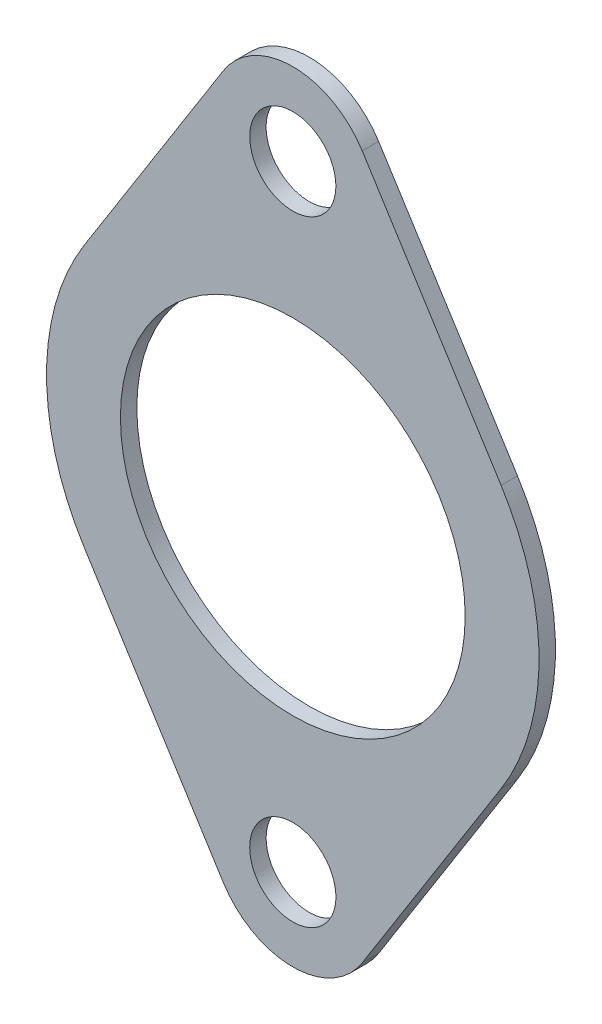
ISO-10303-21;
HEADER;
FILE_DESCRIPTION(('STEP AP214'),'2;1');
FILE_NAME('part.step','',(''),(''),'','','');
FILE_SCHEMA(('AUTOMOTIVE_DESIGN { 1 0 10303 214 1 1 1 1 }'));
ENDSEC;
DATA;
#1=APPLICATION_CONTEXT('core data for automotive mechanical design processes');
#2=APPLICATION_PROTOCOL_DEFINITION('international standard','automotive_design',2000,#1);
#3=PRODUCT_CONTEXT('',#1,'mechanical');
#4=PRODUCT('Part','Part','',(#3));
#5=PRODUCT_RELATED_PRODUCT_CATEGORY('part','',(#4));
#6=PRODUCT_DEFINITION_FORMATION('','',#4);
#7=PRODUCT_DEFINITION_CONTEXT('part definition',#1,'design');
#8=PRODUCT_DEFINITION('design','',#6,#7);
#9=PRODUCT_DEFINITION_SHAPE('','',#8);
#10=(LENGTH_UNIT() NAMED_UNIT(*) SI_UNIT(.MILLI.,.METRE.));
#11=(NAMED_UNIT(*) PLANE_ANGLE_UNIT() SI_UNIT($,.RADIAN.));
#12=(NAMED_UNIT(*) SI_UNIT($,.STERADIAN.) SOLID_ANGLE_UNIT());
#13=UNCERTAINTY_MEASURE_WITH_UNIT(LENGTH_MEASURE(1.E-05),#10,'distance_accuracy_value','');
#14=(GEOMETRIC_REPRESENTATION_CONTEXT(3) GLOBAL_UNCERTAINTY_ASSIGNED_CONTEXT((#13)) GLOBAL_UNIT_ASSIGNED_CONTEXT((#10,
#11,#12)) REPRESENTATION_CONTEXT('',''));
#15=CARTESIAN_POINT('',(0.,0.,0.));
#16=DIRECTION('',(0.,0.,1.));
#17=DIRECTION('',(1.,0.,0.));
#18=AXIS2_PLACEMENT_3D('',#15,#16,#17);
#19=CARTESIAN_POINT('',(0.,0.,2.));
#20=DIRECTION('',(0.,0.,-1.));
#21=DIRECTION('',(-1.,0.,0.));
#22=AXIS2_PLACEMENT_3D('',#19,#20,#21);
#23=PLANE('',#22);
#24=CARTESIAN_POINT('',(0.,0.,2.));
#25=DIRECTION('',(0.,0.,1.));
#26=DIRECTION('',(-1.,0.,0.));
#27=AXIS2_PLACEMENT_3D('',#24,#25,#26);
#28=CIRCLE('',#27,30.);
#29=CARTESIAN_POINT('',(-25.377155080899,16.,2.));
#30=VERTEX_POINT('',#29);
#31=CARTESIAN_POINT('',(-25.377155080899,-16.,2.));
#32=VERTEX_POINT('',#31);
#33=EDGE_CURVE('E151',#30,#32,#28,.T.);
#34=ORIENTED_EDGE('',*,*,#33,.T.);
#35=DIRECTION('',(0.533333333333333,-0.845905169363301,0.));
#36=VECTOR('',#35,1.);
#37=CARTESIAN_POINT('',(-8.45905169363301,-42.8333333333333,2.));
#38=LINE('',#37,#36);
#39=CARTESIAN_POINT('',(-8.45905169363301,-42.8333333333333,2.));
#40=VERTEX_POINT('',#39);
#41=EDGE_CURVE('E99',#32,#40,#38,.T.);
#42=ORIENTED_EDGE('',*,*,#41,.T.);
#43=CARTESIAN_POINT('',(0.,-37.5,2.));
#44=DIRECTION('',(0.,0.,1.));
#45=DIRECTION('',(-1.,0.,0.));
#46=AXIS2_PLACEMENT_3D('',#43,#44,#45);
#47=CIRCLE('',#46,10.);
#48=CARTESIAN_POINT('',(8.45905169363301,-42.8333333333333,2.));
#49=VERTEX_POINT('',#48);
#50=EDGE_CURVE('E166',#40,#49,#47,.T.);
#51=ORIENTED_EDGE('',*,*,#50,.T.);
#52=DIRECTION('',(0.533333333333333,0.845905169363301,0.));
#53=VECTOR('',#52,1.);
#54=CARTESIAN_POINT('',(8.45905169363301,-42.8333333333333,2.));
#55=LINE('',#54,#53);
#56=CARTESIAN_POINT('',(25.377155080899,-16.,2.));
#57=VERTEX_POINT('',#56);
#58=EDGE_CURVE('E179',#49,#57,#55,.T.);
#59=ORIENTED_EDGE('',*,*,#58,.T.);
#60=CARTESIAN_POINT('',(0.,0.,2.));
#61=DIRECTION('',(0.,0.,1.));
#62=DIRECTION('',(1.,0.,0.));
#63=AXIS2_PLACEMENT_3D('',#60,#61,#62);
#64=CIRCLE('',#63,30.);
#65=CARTESIAN_POINT('',(25.377155080899,16.,2.));
#66=VERTEX_POINT('',#65);
#67=EDGE_CURVE('E118',#57,#66,#64,.T.);
#68=ORIENTED_EDGE('',*,*,#67,.T.);
#69=DIRECTION('',(-0.533333333333333,0.845905169363301,0.));
#70=VECTOR('',#69,1.);
#71=CARTESIAN_POINT('',(8.45905169363301,42.8333333333333,2.));
#72=LINE('',#71,#70);
#73=CARTESIAN_POINT('',(8.45905169363301,42.8333333333333,2.));
#74=VERTEX_POINT('',#73);
#75=EDGE_CURVE('E112',#66,#74,#72,.T.);
#76=ORIENTED_EDGE('',*,*,#75,.T.);
#77=CARTESIAN_POINT('',(0.,37.5,2.));
#78=DIRECTION('',(0.,0.,1.));
#79=DIRECTION('',(1.,0.,0.));
#80=AXIS2_PLACEMENT_3D('',#77,#78,#79);
#81=CIRCLE('',#80,10.);
#82=CARTESIAN_POINT('',(-8.45905169363301,42.8333333333333,2.));
#83=VERTEX_POINT('',#82);
#84=EDGE_CURVE('E116',#74,#83,#81,.T.);
#85=ORIENTED_EDGE('',*,*,#84,.T.);
#86=DIRECTION('',(-0.533333333333333,-0.845905169363301,0.));
#87=VECTOR('',#86,1.);
#88=CARTESIAN_POINT('',(-8.45905169363301,42.8333333333333,2.));
#89=LINE('',#88,#87);
#90=EDGE_CURVE('E56',#83,#30,#89,.T.);
#91=ORIENTED_EDGE('',*,*,#90,.T.);
#92=EDGE_LOOP('',(#34,#42,#51,#59,#68,#76,#85,#91));
#93=FACE_BOUND('',#92,.T.);
#94=CARTESIAN_POINT('',(0.,0.,2.));
#95=DIRECTION('',(0.,0.,1.));
#96=DIRECTION('',(1.,0.,0.));
#97=AXIS2_PLACEMENT_3D('',#94,#95,#96);
#98=CIRCLE('',#97,21.);
#99=CARTESIAN_POINT('',(21.,0.,2.));
#100=VERTEX_POINT('',#99);
#101=EDGE_CURVE('E140',#100,#100,#98,.T.);
#102=ORIENTED_EDGE('',*,*,#101,.F.);
#103=EDGE_LOOP('',(#102));
#104=FACE_BOUND('',#103,.T.);
#105=CARTESIAN_POINT('',(0.,37.5,2.));
#106=DIRECTION('',(0.,0.,1.));
#107=DIRECTION('',(1.,0.,0.));
#108=AXIS2_PLACEMENT_3D('',#105,#106,#107);
#109=CIRCLE('',#108,5.25);
#110=CARTESIAN_POINT('',(5.25,37.5,2.));
#111=VERTEX_POINT('',#110);
#112=EDGE_CURVE('E188',#111,#111,#109,.T.);
#113=ORIENTED_EDGE('',*,*,#112,.F.);
#114=EDGE_LOOP('',(#113));
#115=FACE_BOUND('',#114,.T.);
#116=CARTESIAN_POINT('',(0.,-37.5,2.));
#117=DIRECTION('',(0.,0.,1.));
#118=DIRECTION('',(-1.,0.,0.));
#119=AXIS2_PLACEMENT_3D('',#116,#117,#118);
#120=CIRCLE('',#119,5.25);
#121=CARTESIAN_POINT('',(-5.25,-37.5,2.));
#122=VERTEX_POINT('',#121);
#123=EDGE_CURVE('E194',#122,#122,#120,.T.);
#124=ORIENTED_EDGE('',*,*,#123,.F.);
#125=EDGE_LOOP('',(#124));
#126=FACE_BOUND('',#125,.T.);
#127=ADVANCED_FACE('F39',(#93,#104,#115,#126),#23,.F.);
#128=CARTESIAN_POINT('',(0.,0.,0.));
#129=DIRECTION('',(0.,0.,-1.));
#130=DIRECTION('',(-1.,0.,0.));
#131=AXIS2_PLACEMENT_3D('',#128,#129,#130);
#132=PLANE('',#131);
#133=CARTESIAN_POINT('',(0.,37.5,0.));
#134=DIRECTION('',(0.,0.,1.));
#135=DIRECTION('',(1.,0.,0.));
#136=AXIS2_PLACEMENT_3D('',#133,#134,#135);
#137=CIRCLE('',#136,5.25);
#138=CARTESIAN_POINT('',(5.25,37.5,0.));
#139=VERTEX_POINT('',#138);
#140=EDGE_CURVE('E191',#139,#139,#137,.T.);
#141=ORIENTED_EDGE('',*,*,#140,.T.);
#142=EDGE_LOOP('',(#141));
#143=FACE_BOUND('',#142,.T.);
#144=CARTESIAN_POINT('',(0.,0.,0.));
#145=DIRECTION('',(0.,0.,1.));
#146=DIRECTION('',(-1.,0.,0.));
#147=AXIS2_PLACEMENT_3D('',#144,#145,#146);
#148=CIRCLE('',#147,30.);
#149=CARTESIAN_POINT('',(-25.377155080899,16.,0.));
#150=VERTEX_POINT('',#149);
#151=CARTESIAN_POINT('',(-25.377155080899,-16.,0.));
#152=VERTEX_POINT('',#151);
#153=EDGE_CURVE('E136',#150,#152,#148,.T.);
#154=ORIENTED_EDGE('',*,*,#153,.F.);
#155=DIRECTION('',(-0.533333333333333,-0.845905169363301,0.));
#156=VECTOR('',#155,1.);
#157=CARTESIAN_POINT('',(-8.45905169363301,42.8333333333333,0.));
#158=LINE('',#157,#156);
#159=CARTESIAN_POINT('',(-8.45905169363301,42.8333333333333,0.));
#160=VERTEX_POINT('',#159);
#161=EDGE_CURVE('E91',#160,#150,#158,.T.);
#162=ORIENTED_EDGE('',*,*,#161,.F.);
#163=CARTESIAN_POINT('',(0.,37.5,0.));
#164=DIRECTION('',(0.,0.,1.));
#165=DIRECTION('',(1.,0.,0.));
#166=AXIS2_PLACEMENT_3D('',#163,#164,#165);
#167=CIRCLE('',#166,10.);
#168=CARTESIAN_POINT('',(8.45905169363301,42.8333333333333,0.));
#169=VERTEX_POINT('',#168);
#170=EDGE_CURVE('E85',#169,#160,#167,.T.);
#171=ORIENTED_EDGE('',*,*,#170,.F.);
#172=DIRECTION('',(-0.533333333333333,0.845905169363301,0.));
#173=VECTOR('',#172,1.);
#174=CARTESIAN_POINT('',(8.45905169363301,42.8333333333333,0.));
#175=LINE('',#174,#173);
#176=CARTESIAN_POINT('',(25.377155080899,16.,0.));
#177=VERTEX_POINT('',#176);
#178=EDGE_CURVE('E126',#177,#169,#175,.T.);
#179=ORIENTED_EDGE('',*,*,#178,.F.);
#180=CARTESIAN_POINT('',(0.,0.,0.));
#181=DIRECTION('',(0.,0.,1.));
#182=DIRECTION('',(1.,0.,0.));
#183=AXIS2_PLACEMENT_3D('',#180,#181,#182);
#184=CIRCLE('',#183,30.);
#185=CARTESIAN_POINT('',(25.377155080899,-16.,0.));
#186=VERTEX_POINT('',#185);
#187=EDGE_CURVE('E146',#186,#177,#184,.T.);
#188=ORIENTED_EDGE('',*,*,#187,.F.);
#189=DIRECTION('',(0.533333333333333,0.845905169363301,0.));
#190=VECTOR('',#189,1.);
#191=CARTESIAN_POINT('',(8.45905169363301,-42.8333333333333,0.));
#192=LINE('',#191,#190);
#193=CARTESIAN_POINT('',(8.45905169363301,-42.8333333333333,0.));
#194=VERTEX_POINT('',#193);
#195=EDGE_CURVE('E144',#194,#186,#192,.T.);
#196=ORIENTED_EDGE('',*,*,#195,.F.);
#197=CARTESIAN_POINT('',(0.,-37.5,0.));
#198=DIRECTION('',(0.,0.,1.));
#199=DIRECTION('',(-1.,0.,0.));
#200=AXIS2_PLACEMENT_3D('',#197,#198,#199);
#201=CIRCLE('',#200,10.);
#202=CARTESIAN_POINT('',(-8.45905169363301,-42.8333333333333,0.));
#203=VERTEX_POINT('',#202);
#204=EDGE_CURVE('E142',#203,#194,#201,.T.);
#205=ORIENTED_EDGE('',*,*,#204,.F.);
#206=DIRECTION('',(0.533333333333333,-0.845905169363301,0.));
#207=VECTOR('',#206,1.);
#208=CARTESIAN_POINT('',(-8.45905169363301,-42.8333333333333,0.));
#209=LINE('',#208,#207);
#210=EDGE_CURVE('E139',#152,#203,#209,.T.);
#211=ORIENTED_EDGE('',*,*,#210,.F.);
#212=EDGE_LOOP('',(#154,#162,#171,#179,#188,#196,#205,#211));
#213=FACE_BOUND('',#212,.T.);
#214=CARTESIAN_POINT('',(0.,0.,0.));
#215=DIRECTION('',(0.,0.,1.));
#216=DIRECTION('',(1.,0.,0.));
#217=AXIS2_PLACEMENT_3D('',#214,#215,#216);
#218=CIRCLE('',#217,21.);
#219=CARTESIAN_POINT('',(21.,0.,0.));
#220=VERTEX_POINT('',#219);
#221=EDGE_CURVE('E185',#220,#220,#218,.T.);
#222=ORIENTED_EDGE('',*,*,#221,.T.);
#223=EDGE_LOOP('',(#222));
#224=FACE_BOUND('',#223,.T.);
#225=CARTESIAN_POINT('',(0.,-37.5,0.));
#226=DIRECTION('',(0.,0.,1.));
#227=DIRECTION('',(-1.,0.,0.));
#228=AXIS2_PLACEMENT_3D('',#225,#226,#227);
#229=CIRCLE('',#228,5.25);
#230=CARTESIAN_POINT('',(-5.25,-37.5,0.));
#231=VERTEX_POINT('',#230);
#232=EDGE_CURVE('E197',#231,#231,#229,.T.);
#233=ORIENTED_EDGE('',*,*,#232,.T.);
#234=EDGE_LOOP('',(#233));
#235=FACE_BOUND('',#234,.T.);
#236=ADVANCED_FACE('F170',(#143,#213,#224,#235),#132,.T.);
#237=CARTESIAN_POINT('',(0.,0.,2.));
#238=DIRECTION('',(0.,0.,-1.));
#239=DIRECTION('',(-1.,0.,0.));
#240=AXIS2_PLACEMENT_3D('',#237,#238,#239);
#241=CYLINDRICAL_SURFACE('',#240,30.);
#242=ORIENTED_EDGE('',*,*,#153,.T.);
#243=DIRECTION('',(0.,0.,-1.));
#244=VECTOR('',#243,1.);
#245=CARTESIAN_POINT('',(-25.377155080899,-16.,2.));
#246=LINE('',#245,#244);
#247=EDGE_CURVE('E11',#32,#152,#246,.T.);
#248=ORIENTED_EDGE('',*,*,#247,.F.);
#249=ORIENTED_EDGE('',*,*,#33,.F.);
#250=DIRECTION('',(0.,0.,-1.));
#251=VECTOR('',#250,1.);
#252=CARTESIAN_POINT('',(-25.377155080899,16.,2.));
#253=LINE('',#252,#251);
#254=EDGE_CURVE('E132',#30,#150,#253,.T.);
#255=ORIENTED_EDGE('',*,*,#254,.T.);
#256=EDGE_LOOP('',(#242,#248,#249,#255));
#257=FACE_BOUND('',#256,.T.);
#258=ADVANCED_FACE('F41',(#257),#241,.T.);
#259=CARTESIAN_POINT('',(-8.45905169363301,-42.8333333333333,2.));
#260=DIRECTION('',(0.845905169363302,0.533333333333333,0.));
#261=DIRECTION('',(-0.533333333333333,0.845905169363302,0.));
#262=AXIS2_PLACEMENT_3D('',#259,#260,#261);
#263=PLANE('',#262);
#264=ORIENTED_EDGE('',*,*,#210,.T.);
#265=DIRECTION('',(0.,0.,-1.));
#266=VECTOR('',#265,1.);
#267=CARTESIAN_POINT('',(-8.45905169363301,-42.8333333333333,2.));
#268=LINE('',#267,#266);
#269=EDGE_CURVE('E48',#40,#203,#268,.T.);
#270=ORIENTED_EDGE('',*,*,#269,.F.);
#271=ORIENTED_EDGE('',*,*,#41,.F.);
#272=ORIENTED_EDGE('',*,*,#247,.T.);
#273=EDGE_LOOP('',(#264,#270,#271,#272));
#274=FACE_BOUND('',#273,.T.);
#275=ADVANCED_FACE('F229',(#274),#263,.F.);
#276=CARTESIAN_POINT('',(0.,-37.5,2.));
#277=DIRECTION('',(0.,0.,-1.));
#278=DIRECTION('',(-1.,0.,0.));
#279=AXIS2_PLACEMENT_3D('',#276,#277,#278);
#280=CYLINDRICAL_SURFACE('',#279,10.);
#281=ORIENTED_EDGE('',*,*,#204,.T.);
#282=DIRECTION('',(0.,0.,-1.));
#283=VECTOR('',#282,1.);
#284=CARTESIAN_POINT('',(8.45905169363301,-42.8333333333333,2.));
#285=LINE('',#284,#283);
#286=EDGE_CURVE('E158',#49,#194,#285,.T.);
#287=ORIENTED_EDGE('',*,*,#286,.F.);
#288=ORIENTED_EDGE('',*,*,#50,.F.);
#289=ORIENTED_EDGE('',*,*,#269,.T.);
#290=EDGE_LOOP('',(#281,#287,#288,#289));
#291=FACE_BOUND('',#290,.T.);
#292=ADVANCED_FACE('F164',(#291),#280,.T.);
#293=CARTESIAN_POINT('',(8.45905169363301,-42.8333333333333,2.));
#294=DIRECTION('',(-0.845905169363302,0.533333333333333,0.));
#295=DIRECTION('',(-0.533333333333333,-0.845905169363302,0.));
#296=AXIS2_PLACEMENT_3D('',#293,#294,#295);
#297=PLANE('',#296);
#298=ORIENTED_EDGE('',*,*,#195,.T.);
#299=DIRECTION('',(0.,0.,-1.));
#300=VECTOR('',#299,1.);
#301=CARTESIAN_POINT('',(25.377155080899,-16.,2.));
#302=LINE('',#301,#300);
#303=EDGE_CURVE('E155',#57,#186,#302,.T.);
#304=ORIENTED_EDGE('',*,*,#303,.F.);
#305=ORIENTED_EDGE('',*,*,#58,.F.);
#306=ORIENTED_EDGE('',*,*,#286,.T.);
#307=EDGE_LOOP('',(#298,#304,#305,#306));
#308=FACE_BOUND('',#307,.T.);
#309=ADVANCED_FACE('F175',(#308),#297,.F.);
#310=CARTESIAN_POINT('',(0.,0.,2.));
#311=DIRECTION('',(0.,0.,-1.));
#312=DIRECTION('',(-1.,0.,0.));
#313=AXIS2_PLACEMENT_3D('',#310,#311,#312);
#314=CYLINDRICAL_SURFACE('',#313,30.);
#315=ORIENTED_EDGE('',*,*,#187,.T.);
#316=DIRECTION('',(0.,0.,-1.));
#317=VECTOR('',#316,1.);
#318=CARTESIAN_POINT('',(25.377155080899,16.,2.));
#319=LINE('',#318,#317);
#320=EDGE_CURVE('E127',#66,#177,#319,.T.);
#321=ORIENTED_EDGE('',*,*,#320,.F.);
#322=ORIENTED_EDGE('',*,*,#67,.F.);
#323=ORIENTED_EDGE('',*,*,#303,.T.);
#324=EDGE_LOOP('',(#315,#321,#322,#323));
#325=FACE_BOUND('',#324,.T.);
#326=ADVANCED_FACE('F178',(#325),#314,.T.);
#327=CARTESIAN_POINT('',(8.45905169363301,42.8333333333333,2.));
#328=DIRECTION('',(-0.845905169363302,-0.533333333333333,0.));
#329=DIRECTION('',(0.533333333333333,-0.845905169363302,0.));
#330=AXIS2_PLACEMENT_3D('',#327,#328,#329);
#331=PLANE('',#330);
#332=ORIENTED_EDGE('',*,*,#178,.T.);
#333=DIRECTION('',(0.,0.,-1.));
#334=VECTOR('',#333,1.);
#335=CARTESIAN_POINT('',(8.45905169363301,42.8333333333333,2.));
#336=LINE('',#335,#334);
#337=EDGE_CURVE('E123',#74,#169,#336,.T.);
#338=ORIENTED_EDGE('',*,*,#337,.F.);
#339=ORIENTED_EDGE('',*,*,#75,.F.);
#340=ORIENTED_EDGE('',*,*,#320,.T.);
#341=EDGE_LOOP('',(#332,#338,#339,#340));
#342=FACE_BOUND('',#341,.T.);
#343=ADVANCED_FACE('F124',(#342),#331,.F.);
#344=CARTESIAN_POINT('',(0.,37.5,2.));
#345=DIRECTION('',(0.,0.,-1.));
#346=DIRECTION('',(-1.,0.,0.));
#347=AXIS2_PLACEMENT_3D('',#344,#345,#346);
#348=CYLINDRICAL_SURFACE('',#347,10.);
#349=ORIENTED_EDGE('',*,*,#170,.T.);
#350=DIRECTION('',(0.,0.,-1.));
#351=VECTOR('',#350,1.);
#352=CARTESIAN_POINT('',(-8.45905169363301,42.8333333333333,2.));
#353=LINE('',#352,#351);
#354=EDGE_CURVE('E128',#83,#160,#353,.T.);
#355=ORIENTED_EDGE('',*,*,#354,.F.);
#356=ORIENTED_EDGE('',*,*,#84,.F.);
#357=ORIENTED_EDGE('',*,*,#337,.T.);
#358=EDGE_LOOP('',(#349,#355,#356,#357));
#359=FACE_BOUND('',#358,.T.);
#360=ADVANCED_FACE('F130',(#359),#348,.T.);
#361=CARTESIAN_POINT('',(-8.45905169363301,42.8333333333333,2.));
#362=DIRECTION('',(0.845905169363302,-0.533333333333333,0.));
#363=DIRECTION('',(0.533333333333333,0.845905169363302,0.));
#364=AXIS2_PLACEMENT_3D('',#361,#362,#363);
#365=PLANE('',#364);
#366=ORIENTED_EDGE('',*,*,#161,.T.);
#367=ORIENTED_EDGE('',*,*,#254,.F.);
#368=ORIENTED_EDGE('',*,*,#90,.F.);
#369=ORIENTED_EDGE('',*,*,#354,.T.);
#370=EDGE_LOOP('',(#366,#367,#368,#369));
#371=FACE_BOUND('',#370,.T.);
#372=ADVANCED_FACE('F217',(#371),#365,.F.);
#373=CARTESIAN_POINT('',(0.,0.,2.));
#374=DIRECTION('',(0.,0.,-1.));
#375=DIRECTION('',(-1.,0.,0.));
#376=AXIS2_PLACEMENT_3D('',#373,#374,#375);
#377=CYLINDRICAL_SURFACE('',#376,21.);
#378=ORIENTED_EDGE('',*,*,#101,.T.);
#379=EDGE_LOOP('',(#378));
#380=FACE_BOUND('',#379,.T.);
#381=ORIENTED_EDGE('',*,*,#221,.F.);
#382=EDGE_LOOP('',(#381));
#383=FACE_BOUND('',#382,.T.);
#384=ADVANCED_FACE('F214',(#380,#383),#377,.F.);
#385=CARTESIAN_POINT('',(0.,37.5,2.));
#386=DIRECTION('',(0.,0.,-1.));
#387=DIRECTION('',(-1.,0.,0.));
#388=AXIS2_PLACEMENT_3D('',#385,#386,#387);
#389=CYLINDRICAL_SURFACE('',#388,5.25);
#390=ORIENTED_EDGE('',*,*,#112,.T.);
#391=EDGE_LOOP('',(#390));
#392=FACE_BOUND('',#391,.T.);
#393=ORIENTED_EDGE('',*,*,#140,.F.);
#394=EDGE_LOOP('',(#393));
#395=FACE_BOUND('',#394,.T.);
#396=ADVANCED_FACE('F305',(#392,#395),#389,.F.);
#397=CARTESIAN_POINT('',(0.,-37.5,2.));
#398=DIRECTION('',(0.,0.,-1.));
#399=DIRECTION('',(-1.,0.,0.));
#400=AXIS2_PLACEMENT_3D('',#397,#398,#399);
#401=CYLINDRICAL_SURFACE('',#400,5.25);
#402=ORIENTED_EDGE('',*,*,#123,.T.);
#403=EDGE_LOOP('',(#402));
#404=FACE_BOUND('',#403,.T.);
#405=ORIENTED_EDGE('',*,*,#232,.F.);
#406=EDGE_LOOP('',(#405));
#407=FACE_BOUND('',#406,.T.);
#408=ADVANCED_FACE('F203',(#404,#407),#401,.F.);
#409=CLOSED_SHELL('',(#127,#236,#258,#275,#292,#309,#326,#343,#360,#372,#384,#396,#408));
#410=MANIFOLD_SOLID_BREP('B2',#409);
#411=ADVANCED_BREP_SHAPE_REPRESENTATION('',(#18,#410),#14);
#412=SHAPE_DEFINITION_REPRESENTATION(#9,#411);
ENDSEC;
END-ISO-10303-21;
